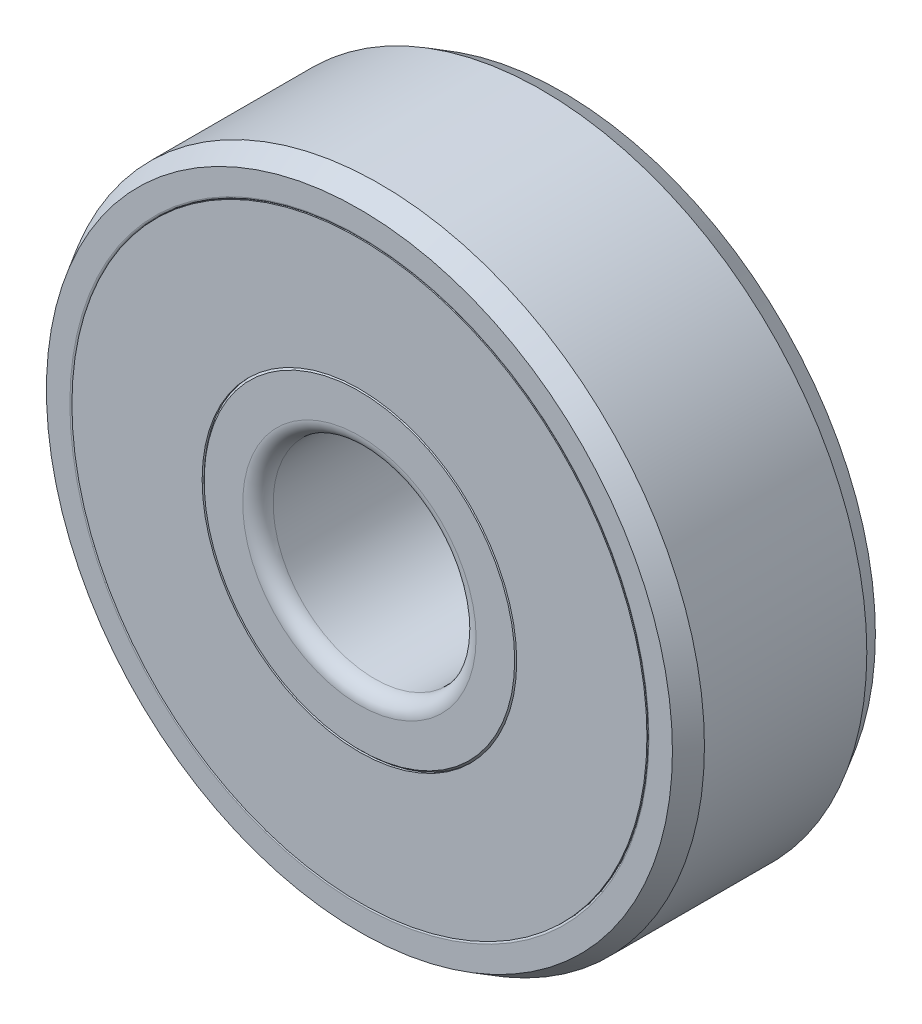
ISO-10303-21;
HEADER;
FILE_DESCRIPTION(('STEP AP214'),'2;1');
FILE_NAME('part.step','',(''),(''),'','','');
FILE_SCHEMA(('AUTOMOTIVE_DESIGN { 1 0 10303 214 1 1 1 1 }'));
ENDSEC;
DATA;
#1=APPLICATION_CONTEXT('core data for automotive mechanical design processes');
#2=APPLICATION_PROTOCOL_DEFINITION('international standard','automotive_design',2000,#1);
#3=PRODUCT_CONTEXT('',#1,'mechanical');
#4=PRODUCT('Part','Part','',(#3));
#5=PRODUCT_RELATED_PRODUCT_CATEGORY('part','',(#4));
#6=PRODUCT_DEFINITION_FORMATION('','',#4);
#7=PRODUCT_DEFINITION_CONTEXT('part definition',#1,'design');
#8=PRODUCT_DEFINITION('design','',#6,#7);
#9=PRODUCT_DEFINITION_SHAPE('','',#8);
#10=(LENGTH_UNIT() NAMED_UNIT(*) SI_UNIT(.MILLI.,.METRE.));
#11=(NAMED_UNIT(*) PLANE_ANGLE_UNIT() SI_UNIT($,.RADIAN.));
#12=(NAMED_UNIT(*) SI_UNIT($,.STERADIAN.) SOLID_ANGLE_UNIT());
#13=UNCERTAINTY_MEASURE_WITH_UNIT(LENGTH_MEASURE(1.E-05),#10,'distance_accuracy_value','');
#14=(GEOMETRIC_REPRESENTATION_CONTEXT(3) GLOBAL_UNCERTAINTY_ASSIGNED_CONTEXT((#13)) GLOBAL_UNIT_ASSIGNED_CONTEXT((#10,
#11,#12)) REPRESENTATION_CONTEXT('',''));
#15=CARTESIAN_POINT('',(0.,0.,0.));
#16=DIRECTION('',(0.,0.,1.));
#17=DIRECTION('',(1.,0.,0.));
#18=AXIS2_PLACEMENT_3D('',#15,#16,#17);
#19=CARTESIAN_POINT('',(4.28378499768937,-3.41620453935103,0.));
#20=DIRECTION('',(-0.781831482468022,0.623489801858743,0.));
#21=DIRECTION('',(0.,0.,-1.));
#22=AXIS2_PLACEMENT_3D('',#19,#20,#21);
#23=SPHERICAL_SURFACE('',#22,2.21527777777778);
#24=CARTESIAN_POINT('',(2.55181108861091,-2.03500143662229,0.));
#25=VERTEX_POINT('',#24);
#26=VERTEX_LOOP('',#25);
#27=FACE_BOUND('',#26,.T.);
#28=ADVANCED_FACE('F52',(#27),#23,.T.);
#29=CLOSED_SHELL('',(#28));
#30=MANIFOLD_SOLID_BREP('B2',#29);
#31=CARTESIAN_POINT('',(5.34179251882959,1.21922928396892,0.));
#32=DIRECTION('',(-0.974927912181826,-0.222520933956305,0.));
#33=DIRECTION('',(0.,0.,-1.));
#34=AXIS2_PLACEMENT_3D('',#31,#32,#33);
#35=SPHERICAL_SURFACE('',#34,2.21527777777778);
#36=CARTESIAN_POINT('',(3.1820563800379,0.726283603885162,0.));
#37=VERTEX_POINT('',#36);
#38=VERTEX_LOOP('',#37);
#39=FACE_BOUND('',#38,.T.);
#40=ADVANCED_FACE('F71',(#39),#35,.T.);
#41=CLOSED_SHELL('',(#40));
#42=MANIFOLD_SOLID_BREP('B6',#41);
#43=CARTESIAN_POINT('',(2.37732132058166,4.93655858871532,0.));
#44=DIRECTION('',(-0.433883739117565,-0.900968867902416,0.));
#45=DIRECTION('',(0.,0.,-1.));
#46=AXIS2_PLACEMENT_3D('',#43,#44,#45);
#47=SPHERICAL_SURFACE('',#46,2.21527777777778);
#48=CARTESIAN_POINT('',(1.41614831517539,2.9406622771815,0.));
#49=VERTEX_POINT('',#48);
#50=VERTEX_LOOP('',#49);
#51=FACE_BOUND('',#50,.T.);
#52=ADVANCED_FACE('F90',(#51),#47,.T.);
#53=CLOSED_SHELL('',(#52));
#54=MANIFOLD_SOLID_BREP('B48',#53);
#55=CARTESIAN_POINT('',(-2.37732132058159,4.93655858871535,0.));
#56=DIRECTION('',(0.433883739117553,-0.900968867902422,0.));
#57=DIRECTION('',(0.,0.,-1.));
#58=AXIS2_PLACEMENT_3D('',#55,#56,#57);
#59=SPHERICAL_SURFACE('',#58,2.21527777777778);
#60=CARTESIAN_POINT('',(-1.41614831517535,2.94066227718152,0.));
#61=VERTEX_POINT('',#60);
#62=VERTEX_LOOP('',#61);
#63=FACE_BOUND('',#62,.T.);
#64=ADVANCED_FACE('F109',(#63),#59,.T.);
#65=CLOSED_SHELL('',(#64));
#66=MANIFOLD_SOLID_BREP('B67',#65);
#67=CARTESIAN_POINT('',(-5.34179251882957,1.21922928396899,0.));
#68=DIRECTION('',(0.974927912181823,-0.222520933956318,0.));
#69=DIRECTION('',(0.,0.,-1.));
#70=AXIS2_PLACEMENT_3D('',#67,#68,#69);
#71=SPHERICAL_SURFACE('',#70,2.21527777777778);
#72=CARTESIAN_POINT('',(-3.18205638003789,0.726283603885205,0.));
#73=VERTEX_POINT('',#72);
#74=VERTEX_LOOP('',#73);
#75=FACE_BOUND('',#74,.T.);
#76=ADVANCED_FACE('F128',(#75),#71,.T.);
#77=CLOSED_SHELL('',(#76));
#78=MANIFOLD_SOLID_BREP('B86',#77);
#79=CARTESIAN_POINT('',(-4.28378499768942,-3.41620453935097,0.));
#80=DIRECTION('',(0.781831482468031,0.623489801858732,0.));
#81=DIRECTION('',(0.,0.,-1.));
#82=AXIS2_PLACEMENT_3D('',#79,#80,#81);
#83=SPHERICAL_SURFACE('',#82,2.21527777777778);
#84=CARTESIAN_POINT('',(-2.55181108861093,-2.03500143662225,0.));
#85=VERTEX_POINT('',#84);
#86=VERTEX_LOOP('',#85);
#87=FACE_BOUND('',#86,.T.);
#88=ADVANCED_FACE('F147',(#87),#83,.T.);
#89=CLOSED_SHELL('',(#88));
#90=MANIFOLD_SOLID_BREP('B105',#89);
#91=CARTESIAN_POINT('',(0.,-5.47916666666667,0.));
#92=DIRECTION('',(0.,1.,0.));
#93=DIRECTION('',(0.,0.,-1.));
#94=AXIS2_PLACEMENT_3D('',#91,#92,#93);
#95=SPHERICAL_SURFACE('',#94,2.21527777777778);
#96=CARTESIAN_POINT('',(0.,-3.26388888888889,0.));
#97=VERTEX_POINT('',#96);
#98=VERTEX_LOOP('',#97);
#99=FACE_BOUND('',#98,.T.);
#100=ADVANCED_FACE('F168',(#99),#95,.T.);
#101=CLOSED_SHELL('',(#100));
#102=MANIFOLD_SOLID_BREP('B124',#101);
#103=CARTESIAN_POINT('',(0.,-3.875,2.5));
#104=DIRECTION('',(0.,0.,1.));
#105=DIRECTION('',(1.,0.,0.));
#106=AXIS2_PLACEMENT_3D('',#103,#104,#105);
#107=PLANE('',#106);
#108=CARTESIAN_POINT('',(0.,0.,2.5));
#109=DIRECTION('',(0.,0.,1.));
#110=DIRECTION('',(1.,0.,0.));
#111=AXIS2_PLACEMENT_3D('',#108,#109,#110);
#112=CIRCLE('',#111,7.08333333333333);
#113=CARTESIAN_POINT('',(7.08333333333333,0.,2.5));
#114=VERTEX_POINT('',#113);
#115=EDGE_CURVE('E167',#114,#114,#112,.T.);
#116=ORIENTED_EDGE('',*,*,#115,.T.);
#117=EDGE_LOOP('',(#116));
#118=FACE_BOUND('',#117,.T.);
#119=CARTESIAN_POINT('',(0.,0.,2.5));
#120=DIRECTION('',(0.,0.,1.));
#121=DIRECTION('',(1.,0.,0.));
#122=AXIS2_PLACEMENT_3D('',#119,#120,#121);
#123=CIRCLE('',#122,3.875);
#124=CARTESIAN_POINT('',(3.875,0.,2.5));
#125=VERTEX_POINT('',#124);
#126=EDGE_CURVE('E208',#125,#125,#123,.T.);
#127=ORIENTED_EDGE('',*,*,#126,.F.);
#128=EDGE_LOOP('',(#127));
#129=FACE_BOUND('',#128,.T.);
#130=ADVANCED_FACE('F189',(#118,#129),#107,.T.);
#131=CARTESIAN_POINT('',(0.,0.,2.5));
#132=DIRECTION('',(0.,0.,1.));
#133=DIRECTION('',(1.,0.,0.));
#134=AXIS2_PLACEMENT_3D('',#131,#132,#133);
#135=CYLINDRICAL_SURFACE('',#134,7.08333333333333);
#136=CARTESIAN_POINT('',(0.,0.,2.28645833333333));
#137=DIRECTION('',(0.,0.,1.));
#138=DIRECTION('',(1.,0.,0.));
#139=AXIS2_PLACEMENT_3D('',#136,#137,#138);
#140=CIRCLE('',#139,7.08333333333333);
#141=CARTESIAN_POINT('',(7.08333333333333,0.,2.28645833333333));
#142=VERTEX_POINT('',#141);
#143=EDGE_CURVE('E196',#142,#142,#140,.T.);
#144=ORIENTED_EDGE('',*,*,#143,.T.);
#145=EDGE_LOOP('',(#144));
#146=FACE_BOUND('',#145,.T.);
#147=ORIENTED_EDGE('',*,*,#115,.F.);
#148=EDGE_LOOP('',(#147));
#149=FACE_BOUND('',#148,.T.);
#150=ADVANCED_FACE('F220',(#146,#149),#135,.T.);
#151=CARTESIAN_POINT('',(0.,-3.875,2.28645833333333));
#152=DIRECTION('',(0.,0.,-1.));
#153=DIRECTION('',(-1.,0.,0.));
#154=AXIS2_PLACEMENT_3D('',#151,#152,#153);
#155=PLANE('',#154);
#156=CARTESIAN_POINT('',(0.,0.,2.28645833333333));
#157=DIRECTION('',(0.,0.,1.));
#158=DIRECTION('',(1.,0.,0.));
#159=AXIS2_PLACEMENT_3D('',#156,#157,#158);
#160=CIRCLE('',#159,3.875);
#161=CARTESIAN_POINT('',(3.875,0.,2.28645833333333));
#162=VERTEX_POINT('',#161);
#163=EDGE_CURVE('E202',#162,#162,#160,.T.);
#164=ORIENTED_EDGE('',*,*,#163,.T.);
#165=EDGE_LOOP('',(#164));
#166=FACE_BOUND('',#165,.T.);
#167=ORIENTED_EDGE('',*,*,#143,.F.);
#168=EDGE_LOOP('',(#167));
#169=FACE_BOUND('',#168,.T.);
#170=ADVANCED_FACE('F224',(#166,#169),#155,.T.);
#171=CARTESIAN_POINT('',(0.,0.,2.5));
#172=DIRECTION('',(0.,0.,1.));
#173=DIRECTION('',(1.,0.,0.));
#174=AXIS2_PLACEMENT_3D('',#171,#172,#173);
#175=CYLINDRICAL_SURFACE('',#174,3.875);
#176=ORIENTED_EDGE('',*,*,#126,.T.);
#177=EDGE_LOOP('',(#176));
#178=FACE_BOUND('',#177,.T.);
#179=ORIENTED_EDGE('',*,*,#163,.F.);
#180=EDGE_LOOP('',(#179));
#181=FACE_BOUND('',#180,.T.);
#182=ADVANCED_FACE('F216',(#178,#181),#175,.F.);
#183=CLOSED_SHELL('',(#130,#150,#170,#182));
#184=MANIFOLD_SOLID_BREP('B143',#183);
#185=CARTESIAN_POINT('',(0.,0.,2.125));
#186=DIRECTION('',(0.,0.,1.));
#187=DIRECTION('',(1.,0.,0.));
#188=AXIS2_PLACEMENT_3D('',#185,#186,#187);
#189=TOROIDAL_SURFACE('',#188,2.875,0.375);
#190=CARTESIAN_POINT('',(0.,0.,2.5));
#191=DIRECTION('',(0.,0.,1.));
#192=DIRECTION('',(1.,0.,0.));
#193=AXIS2_PLACEMENT_3D('',#190,#191,#192);
#194=CIRCLE('',#193,2.875);
#195=CARTESIAN_POINT('',(2.875,0.,2.5));
#196=VERTEX_POINT('',#195);
#197=EDGE_CURVE('E188',#196,#196,#194,.T.);
#198=ORIENTED_EDGE('',*,*,#197,.T.);
#199=EDGE_LOOP('',(#198));
#200=FACE_BOUND('',#199,.T.);
#201=CARTESIAN_POINT('',(0.,0.,2.125));
#202=DIRECTION('',(0.,0.,1.));
#203=DIRECTION('',(1.,0.,0.));
#204=AXIS2_PLACEMENT_3D('',#201,#202,#203);
#205=CIRCLE('',#204,2.5);
#206=CARTESIAN_POINT('',(2.5,0.,2.125));
#207=VERTEX_POINT('',#206);
#208=EDGE_CURVE('E311',#207,#207,#205,.T.);
#209=ORIENTED_EDGE('',*,*,#208,.F.);
#210=EDGE_LOOP('',(#209));
#211=FACE_BOUND('',#210,.T.);
#212=ADVANCED_FACE('F266',(#200,#211),#189,.T.);
#213=CARTESIAN_POINT('',(0.,-3.825,2.5));
#214=DIRECTION('',(0.,0.,1.));
#215=DIRECTION('',(1.,0.,0.));
#216=AXIS2_PLACEMENT_3D('',#213,#214,#215);
#217=PLANE('',#216);
#218=CARTESIAN_POINT('',(0.,0.,2.5));
#219=DIRECTION('',(0.,0.,1.));
#220=DIRECTION('',(1.,0.,0.));
#221=AXIS2_PLACEMENT_3D('',#218,#219,#220);
#222=CIRCLE('',#221,3.825);
#223=CARTESIAN_POINT('',(3.825,0.,2.5));
#224=VERTEX_POINT('',#223);
#225=EDGE_CURVE('E273',#224,#224,#222,.T.);
#226=ORIENTED_EDGE('',*,*,#225,.T.);
#227=EDGE_LOOP('',(#226));
#228=FACE_BOUND('',#227,.T.);
#229=ORIENTED_EDGE('',*,*,#197,.F.);
#230=EDGE_LOOP('',(#229));
#231=FACE_BOUND('',#230,.T.);
#232=ADVANCED_FACE('F321',(#228,#231),#217,.T.);
#233=CARTESIAN_POINT('',(0.,0.,2.5));
#234=DIRECTION('',(0.,0.,-1.));
#235=DIRECTION('',(-1.,0.,0.));
#236=AXIS2_PLACEMENT_3D('',#233,#234,#235);
#237=CONICAL_SURFACE('',#236,3.825,0.785398163397453);
#238=CARTESIAN_POINT('',(0.,0.,2.45));
#239=DIRECTION('',(0.,0.,1.));
#240=DIRECTION('',(1.,0.,0.));
#241=AXIS2_PLACEMENT_3D('',#238,#239,#240);
#242=CIRCLE('',#241,3.875);
#243=CARTESIAN_POINT('',(3.875,0.,2.45));
#244=VERTEX_POINT('',#243);
#245=EDGE_CURVE('E279',#244,#244,#242,.T.);
#246=ORIENTED_EDGE('',*,*,#245,.T.);
#247=EDGE_LOOP('',(#246));
#248=FACE_BOUND('',#247,.T.);
#249=ORIENTED_EDGE('',*,*,#225,.F.);
#250=EDGE_LOOP('',(#249));
#251=FACE_BOUND('',#250,.T.);
#252=ADVANCED_FACE('F325',(#248,#251),#237,.T.);
#253=CARTESIAN_POINT('',(0.,0.,2.5));
#254=DIRECTION('',(0.,0.,1.));
#255=DIRECTION('',(1.,0.,0.));
#256=AXIS2_PLACEMENT_3D('',#253,#254,#255);
#257=CYLINDRICAL_SURFACE('',#256,3.875);
#258=CARTESIAN_POINT('',(0.,0.,1.52777777777778));
#259=DIRECTION('',(0.,0.,1.));
#260=DIRECTION('',(1.,0.,0.));
#261=AXIS2_PLACEMENT_3D('',#258,#259,#260);
#262=CIRCLE('',#261,3.875);
#263=CARTESIAN_POINT('',(3.875,0.,1.52777777777778));
#264=VERTEX_POINT('',#263);
#265=EDGE_CURVE('E285',#264,#264,#262,.T.);
#266=ORIENTED_EDGE('',*,*,#265,.T.);
#267=EDGE_LOOP('',(#266));
#268=FACE_BOUND('',#267,.T.);
#269=ORIENTED_EDGE('',*,*,#245,.F.);
#270=EDGE_LOOP('',(#269));
#271=FACE_BOUND('',#270,.T.);
#272=ADVANCED_FACE('F329',(#268,#271),#257,.T.);
#273=CARTESIAN_POINT('',(0.,0.,0.));
#274=DIRECTION('',(0.,0.,1.));
#275=DIRECTION('',(1.,0.,0.));
#276=AXIS2_PLACEMENT_3D('',#273,#274,#275);
#277=TOROIDAL_SURFACE('',#276,5.47916666666667,2.21527777777778);
#278=CARTESIAN_POINT('',(0.,0.,-1.52777777777778));
#279=DIRECTION('',(0.,0.,1.));
#280=DIRECTION('',(1.,0.,0.));
#281=AXIS2_PLACEMENT_3D('',#278,#279,#280);
#282=CIRCLE('',#281,3.875);
#283=CARTESIAN_POINT('',(3.875,0.,-1.52777777777778));
#284=VERTEX_POINT('',#283);
#285=EDGE_CURVE('E291',#284,#284,#282,.T.);
#286=ORIENTED_EDGE('',*,*,#285,.T.);
#287=EDGE_LOOP('',(#286));
#288=FACE_BOUND('',#287,.T.);
#289=ORIENTED_EDGE('',*,*,#265,.F.);
#290=EDGE_LOOP('',(#289));
#291=FACE_BOUND('',#290,.T.);
#292=ADVANCED_FACE('F336',(#288,#291),#277,.F.);
#293=CARTESIAN_POINT('',(0.,0.,2.5));
#294=DIRECTION('',(0.,0.,1.));
#295=DIRECTION('',(1.,0.,0.));
#296=AXIS2_PLACEMENT_3D('',#293,#294,#295);
#297=CYLINDRICAL_SURFACE('',#296,3.875);
#298=CARTESIAN_POINT('',(0.,0.,-2.45));
#299=DIRECTION('',(0.,0.,1.));
#300=DIRECTION('',(1.,0.,0.));
#301=AXIS2_PLACEMENT_3D('',#298,#299,#300);
#302=CIRCLE('',#301,3.875);
#303=CARTESIAN_POINT('',(3.875,0.,-2.45));
#304=VERTEX_POINT('',#303);
#305=EDGE_CURVE('E295',#304,#304,#302,.T.);
#306=ORIENTED_EDGE('',*,*,#305,.T.);
#307=EDGE_LOOP('',(#306));
#308=FACE_BOUND('',#307,.T.);
#309=ORIENTED_EDGE('',*,*,#285,.F.);
#310=EDGE_LOOP('',(#309));
#311=FACE_BOUND('',#310,.T.);
#312=ADVANCED_FACE('F340',(#308,#311),#297,.T.);
#313=CARTESIAN_POINT('',(0.,0.,-2.45));
#314=DIRECTION('',(0.,0.,1.));
#315=DIRECTION('',(1.,0.,0.));
#316=AXIS2_PLACEMENT_3D('',#313,#314,#315);
#317=CONICAL_SURFACE('',#316,3.875,0.785398163397453);
#318=CARTESIAN_POINT('',(0.,0.,-2.5));
#319=DIRECTION('',(0.,0.,1.));
#320=DIRECTION('',(1.,0.,0.));
#321=AXIS2_PLACEMENT_3D('',#318,#319,#320);
#322=CIRCLE('',#321,3.825);
#323=CARTESIAN_POINT('',(3.825,0.,-2.5));
#324=VERTEX_POINT('',#323);
#325=EDGE_CURVE('E299',#324,#324,#322,.T.);
#326=ORIENTED_EDGE('',*,*,#325,.T.);
#327=EDGE_LOOP('',(#326));
#328=FACE_BOUND('',#327,.T.);
#329=ORIENTED_EDGE('',*,*,#305,.F.);
#330=EDGE_LOOP('',(#329));
#331=FACE_BOUND('',#330,.T.);
#332=ADVANCED_FACE('F344',(#328,#331),#317,.T.);
#333=CARTESIAN_POINT('',(0.,-3.825,-2.5));
#334=DIRECTION('',(0.,0.,-1.));
#335=DIRECTION('',(-1.,0.,0.));
#336=AXIS2_PLACEMENT_3D('',#333,#334,#335);
#337=PLANE('',#336);
#338=CARTESIAN_POINT('',(0.,0.,-2.5));
#339=DIRECTION('',(0.,0.,1.));
#340=DIRECTION('',(1.,0.,0.));
#341=AXIS2_PLACEMENT_3D('',#338,#339,#340);
#342=CIRCLE('',#341,2.875);
#343=CARTESIAN_POINT('',(2.875,0.,-2.5));
#344=VERTEX_POINT('',#343);
#345=EDGE_CURVE('E303',#344,#344,#342,.T.);
#346=ORIENTED_EDGE('',*,*,#345,.T.);
#347=EDGE_LOOP('',(#346));
#348=FACE_BOUND('',#347,.T.);
#349=ORIENTED_EDGE('',*,*,#325,.F.);
#350=EDGE_LOOP('',(#349));
#351=FACE_BOUND('',#350,.T.);
#352=ADVANCED_FACE('F348',(#348,#351),#337,.T.);
#353=CARTESIAN_POINT('',(0.,0.,-2.125));
#354=DIRECTION('',(0.,0.,1.));
#355=DIRECTION('',(1.,0.,0.));
#356=AXIS2_PLACEMENT_3D('',#353,#354,#355);
#357=TOROIDAL_SURFACE('',#356,2.875,0.375);
#358=CARTESIAN_POINT('',(0.,0.,-2.125));
#359=DIRECTION('',(0.,0.,1.));
#360=DIRECTION('',(1.,0.,0.));
#361=AXIS2_PLACEMENT_3D('',#358,#359,#360);
#362=CIRCLE('',#361,2.5);
#363=CARTESIAN_POINT('',(2.5,0.,-2.125));
#364=VERTEX_POINT('',#363);
#365=EDGE_CURVE('E307',#364,#364,#362,.T.);
#366=ORIENTED_EDGE('',*,*,#365,.T.);
#367=EDGE_LOOP('',(#366));
#368=FACE_BOUND('',#367,.T.);
#369=ORIENTED_EDGE('',*,*,#345,.F.);
#370=EDGE_LOOP('',(#369));
#371=FACE_BOUND('',#370,.T.);
#372=ADVANCED_FACE('F352',(#368,#371),#357,.T.);
#373=CARTESIAN_POINT('',(0.,0.,2.5));
#374=DIRECTION('',(0.,0.,1.));
#375=DIRECTION('',(1.,0.,0.));
#376=AXIS2_PLACEMENT_3D('',#373,#374,#375);
#377=CYLINDRICAL_SURFACE('',#376,2.5);
#378=ORIENTED_EDGE('',*,*,#208,.T.);
#379=EDGE_LOOP('',(#378));
#380=FACE_BOUND('',#379,.T.);
#381=ORIENTED_EDGE('',*,*,#365,.F.);
#382=EDGE_LOOP('',(#381));
#383=FACE_BOUND('',#382,.T.);
#384=ADVANCED_FACE('F317',(#380,#383),#377,.F.);
#385=CLOSED_SHELL('',(#212,#232,#252,#272,#292,#312,#332,#352,#372,#384));
#386=MANIFOLD_SOLID_BREP('B162',#385);
#387=CARTESIAN_POINT('',(0.,0.,2.5));
#388=DIRECTION('',(0.,0.,-1.));
#389=DIRECTION('',(-1.,0.,0.));
#390=AXIS2_PLACEMENT_3D('',#387,#388,#389);
#391=CONICAL_SURFACE('',#390,7.7113248654052,0.523598775598276);
#392=CARTESIAN_POINT('',(0.,0.,2.));
#393=DIRECTION('',(0.,0.,1.));
#394=DIRECTION('',(1.,0.,0.));
#395=AXIS2_PLACEMENT_3D('',#392,#393,#394);
#396=CIRCLE('',#395,8.);
#397=CARTESIAN_POINT('',(8.,0.,2.));
#398=VERTEX_POINT('',#397);
#399=EDGE_CURVE('E265',#398,#398,#396,.T.);
#400=ORIENTED_EDGE('',*,*,#399,.T.);
#401=EDGE_LOOP('',(#400));
#402=FACE_BOUND('',#401,.T.);
#403=CARTESIAN_POINT('',(0.,0.,2.5));
#404=DIRECTION('',(0.,0.,1.));
#405=DIRECTION('',(1.,0.,0.));
#406=AXIS2_PLACEMENT_3D('',#403,#404,#405);
#407=CIRCLE('',#406,7.7113248654052);
#408=CARTESIAN_POINT('',(7.7113248654052,0.,2.5));
#409=VERTEX_POINT('',#408);
#410=EDGE_CURVE('E483',#409,#409,#407,.T.);
#411=ORIENTED_EDGE('',*,*,#410,.F.);
#412=EDGE_LOOP('',(#411));
#413=FACE_BOUND('',#412,.T.);
#414=ADVANCED_FACE('F438',(#402,#413),#391,.T.);
#415=CARTESIAN_POINT('',(0.,0.,2.5));
#416=DIRECTION('',(0.,0.,1.));
#417=DIRECTION('',(1.,0.,0.));
#418=AXIS2_PLACEMENT_3D('',#415,#416,#417);
#419=CYLINDRICAL_SURFACE('',#418,8.);
#420=CARTESIAN_POINT('',(0.,0.,-2.));
#421=DIRECTION('',(0.,0.,1.));
#422=DIRECTION('',(1.,0.,0.));
#423=AXIS2_PLACEMENT_3D('',#420,#421,#422);
#424=CIRCLE('',#423,8.);
#425=CARTESIAN_POINT('',(8.,0.,-2.));
#426=VERTEX_POINT('',#425);
#427=EDGE_CURVE('E445',#426,#426,#424,.T.);
#428=ORIENTED_EDGE('',*,*,#427,.T.);
#429=EDGE_LOOP('',(#428));
#430=FACE_BOUND('',#429,.T.);
#431=ORIENTED_EDGE('',*,*,#399,.F.);
#432=EDGE_LOOP('',(#431));
#433=FACE_BOUND('',#432,.T.);
#434=ADVANCED_FACE('F493',(#430,#433),#419,.T.);
#435=CARTESIAN_POINT('',(0.,0.,-2.));
#436=DIRECTION('',(0.,0.,1.));
#437=DIRECTION('',(1.,0.,0.));
#438=AXIS2_PLACEMENT_3D('',#435,#436,#437);
#439=CONICAL_SURFACE('',#438,8.,0.523598775598277);
#440=CARTESIAN_POINT('',(0.,0.,-2.5));
#441=DIRECTION('',(0.,0.,1.));
#442=DIRECTION('',(1.,0.,0.));
#443=AXIS2_PLACEMENT_3D('',#440,#441,#442);
#444=CIRCLE('',#443,7.7113248654052);
#445=CARTESIAN_POINT('',(7.7113248654052,0.,-2.5));
#446=VERTEX_POINT('',#445);
#447=EDGE_CURVE('E451',#446,#446,#444,.T.);
#448=ORIENTED_EDGE('',*,*,#447,.T.);
#449=EDGE_LOOP('',(#448));
#450=FACE_BOUND('',#449,.T.);
#451=ORIENTED_EDGE('',*,*,#427,.F.);
#452=EDGE_LOOP('',(#451));
#453=FACE_BOUND('',#452,.T.);
#454=ADVANCED_FACE('F497',(#450,#453),#439,.T.);
#455=CARTESIAN_POINT('',(0.,-7.13333333333333,-2.5));
#456=DIRECTION('',(0.,0.,-1.));
#457=DIRECTION('',(-1.,0.,0.));
#458=AXIS2_PLACEMENT_3D('',#455,#456,#457);
#459=PLANE('',#458);
#460=CARTESIAN_POINT('',(0.,0.,-2.5));
#461=DIRECTION('',(0.,0.,1.));
#462=DIRECTION('',(1.,0.,0.));
#463=AXIS2_PLACEMENT_3D('',#460,#461,#462);
#464=CIRCLE('',#463,7.13333333333333);
#465=CARTESIAN_POINT('',(7.13333333333333,0.,-2.5));
#466=VERTEX_POINT('',#465);
#467=EDGE_CURVE('E457',#466,#466,#464,.T.);
#468=ORIENTED_EDGE('',*,*,#467,.T.);
#469=EDGE_LOOP('',(#468));
#470=FACE_BOUND('',#469,.T.);
#471=ORIENTED_EDGE('',*,*,#447,.F.);
#472=EDGE_LOOP('',(#471));
#473=FACE_BOUND('',#472,.T.);
#474=ADVANCED_FACE('F501',(#470,#473),#459,.T.);
#475=CARTESIAN_POINT('',(0.,0.,-2.45));
#476=DIRECTION('',(0.,0.,1.));
#477=DIRECTION('',(1.,0.,0.));
#478=AXIS2_PLACEMENT_3D('',#475,#476,#477);
#479=TOROIDAL_SURFACE('',#478,7.13333333333333,0.0499999999999997);
#480=CARTESIAN_POINT('',(0.,0.,-2.45));
#481=DIRECTION('',(0.,0.,1.));
#482=DIRECTION('',(1.,0.,0.));
#483=AXIS2_PLACEMENT_3D('',#480,#481,#482);
#484=CIRCLE('',#483,7.08333333333333);
#485=CARTESIAN_POINT('',(7.08333333333333,0.,-2.45));
#486=VERTEX_POINT('',#485);
#487=EDGE_CURVE('E463',#486,#486,#484,.T.);
#488=ORIENTED_EDGE('',*,*,#487,.T.);
#489=EDGE_LOOP('',(#488));
#490=FACE_BOUND('',#489,.T.);
#491=ORIENTED_EDGE('',*,*,#467,.F.);
#492=EDGE_LOOP('',(#491));
#493=FACE_BOUND('',#492,.T.);
#494=ADVANCED_FACE('F508',(#490,#493),#479,.T.);
#495=CARTESIAN_POINT('',(0.,0.,2.5));
#496=DIRECTION('',(0.,0.,1.));
#497=DIRECTION('',(1.,0.,0.));
#498=AXIS2_PLACEMENT_3D('',#495,#496,#497);
#499=CYLINDRICAL_SURFACE('',#498,7.08333333333333);
#500=CARTESIAN_POINT('',(0.,0.,-1.52777777777778));
#501=DIRECTION('',(0.,0.,1.));
#502=DIRECTION('',(1.,0.,0.));
#503=AXIS2_PLACEMENT_3D('',#500,#501,#502);
#504=CIRCLE('',#503,7.08333333333333);
#505=CARTESIAN_POINT('',(7.08333333333333,0.,-1.52777777777778));
#506=VERTEX_POINT('',#505);
#507=EDGE_CURVE('E467',#506,#506,#504,.T.);
#508=ORIENTED_EDGE('',*,*,#507,.T.);
#509=EDGE_LOOP('',(#508));
#510=FACE_BOUND('',#509,.T.);
#511=ORIENTED_EDGE('',*,*,#487,.F.);
#512=EDGE_LOOP('',(#511));
#513=FACE_BOUND('',#512,.T.);
#514=ADVANCED_FACE('F512',(#510,#513),#499,.F.);
#515=CARTESIAN_POINT('',(0.,0.,0.));
#516=DIRECTION('',(0.,0.,1.));
#517=DIRECTION('',(1.,0.,0.));
#518=AXIS2_PLACEMENT_3D('',#515,#516,#517);
#519=TOROIDAL_SURFACE('',#518,5.47916666666667,2.21527777777778);
#520=CARTESIAN_POINT('',(0.,0.,1.52777777777778));
#521=DIRECTION('',(0.,0.,1.));
#522=DIRECTION('',(1.,0.,0.));
#523=AXIS2_PLACEMENT_3D('',#520,#521,#522);
#524=CIRCLE('',#523,7.08333333333333);
#525=CARTESIAN_POINT('',(7.08333333333333,0.,1.52777777777778));
#526=VERTEX_POINT('',#525);
#527=EDGE_CURVE('E471',#526,#526,#524,.T.);
#528=ORIENTED_EDGE('',*,*,#527,.T.);
#529=EDGE_LOOP('',(#528));
#530=FACE_BOUND('',#529,.T.);
#531=ORIENTED_EDGE('',*,*,#507,.F.);
#532=EDGE_LOOP('',(#531));
#533=FACE_BOUND('',#532,.T.);
#534=ADVANCED_FACE('F516',(#530,#533),#519,.F.);
#535=CARTESIAN_POINT('',(0.,0.,2.5));
#536=DIRECTION('',(0.,0.,1.));
#537=DIRECTION('',(1.,0.,0.));
#538=AXIS2_PLACEMENT_3D('',#535,#536,#537);
#539=CYLINDRICAL_SURFACE('',#538,7.08333333333333);
#540=CARTESIAN_POINT('',(0.,0.,2.45));
#541=DIRECTION('',(0.,0.,1.));
#542=DIRECTION('',(1.,0.,0.));
#543=AXIS2_PLACEMENT_3D('',#540,#541,#542);
#544=CIRCLE('',#543,7.08333333333333);
#545=CARTESIAN_POINT('',(7.08333333333333,0.,2.45));
#546=VERTEX_POINT('',#545);
#547=EDGE_CURVE('E475',#546,#546,#544,.T.);
#548=ORIENTED_EDGE('',*,*,#547,.T.);
#549=EDGE_LOOP('',(#548));
#550=FACE_BOUND('',#549,.T.);
#551=ORIENTED_EDGE('',*,*,#527,.F.);
#552=EDGE_LOOP('',(#551));
#553=FACE_BOUND('',#552,.T.);
#554=ADVANCED_FACE('F520',(#550,#553),#539,.F.);
#555=CARTESIAN_POINT('',(0.,0.,2.45));
#556=DIRECTION('',(0.,0.,1.));
#557=DIRECTION('',(1.,0.,0.));
#558=AXIS2_PLACEMENT_3D('',#555,#556,#557);
#559=TOROIDAL_SURFACE('',#558,7.13333333333333,0.0499999999999997);
#560=CARTESIAN_POINT('',(0.,0.,2.5));
#561=DIRECTION('',(0.,0.,1.));
#562=DIRECTION('',(1.,0.,0.));
#563=AXIS2_PLACEMENT_3D('',#560,#561,#562);
#564=CIRCLE('',#563,7.13333333333333);
#565=CARTESIAN_POINT('',(7.13333333333333,0.,2.5));
#566=VERTEX_POINT('',#565);
#567=EDGE_CURVE('E479',#566,#566,#564,.T.);
#568=ORIENTED_EDGE('',*,*,#567,.T.);
#569=EDGE_LOOP('',(#568));
#570=FACE_BOUND('',#569,.T.);
#571=ORIENTED_EDGE('',*,*,#547,.F.);
#572=EDGE_LOOP('',(#571));
#573=FACE_BOUND('',#572,.T.);
#574=ADVANCED_FACE('F524',(#570,#573),#559,.T.);
#575=CARTESIAN_POINT('',(0.,-7.13333333333333,2.5));
#576=DIRECTION('',(0.,0.,1.));
#577=DIRECTION('',(1.,0.,0.));
#578=AXIS2_PLACEMENT_3D('',#575,#576,#577);
#579=PLANE('',#578);
#580=ORIENTED_EDGE('',*,*,#410,.T.);
#581=EDGE_LOOP('',(#580));
#582=FACE_BOUND('',#581,.T.);
#583=ORIENTED_EDGE('',*,*,#567,.F.);
#584=EDGE_LOOP('',(#583));
#585=FACE_BOUND('',#584,.T.);
#586=ADVANCED_FACE('F489',(#582,#585),#579,.T.);
#587=CLOSED_SHELL('',(#414,#434,#454,#474,#494,#514,#534,#554,#574,#586));
#588=MANIFOLD_SOLID_BREP('B183',#587);
#589=ADVANCED_BREP_SHAPE_REPRESENTATION('',(#18,#30,#42,#54,#66,#78,#90,#102,#184,#386,#588),#14);
#590=SHAPE_DEFINITION_REPRESENTATION(#9,#589);
ENDSEC;
END-ISO-10303-21;
